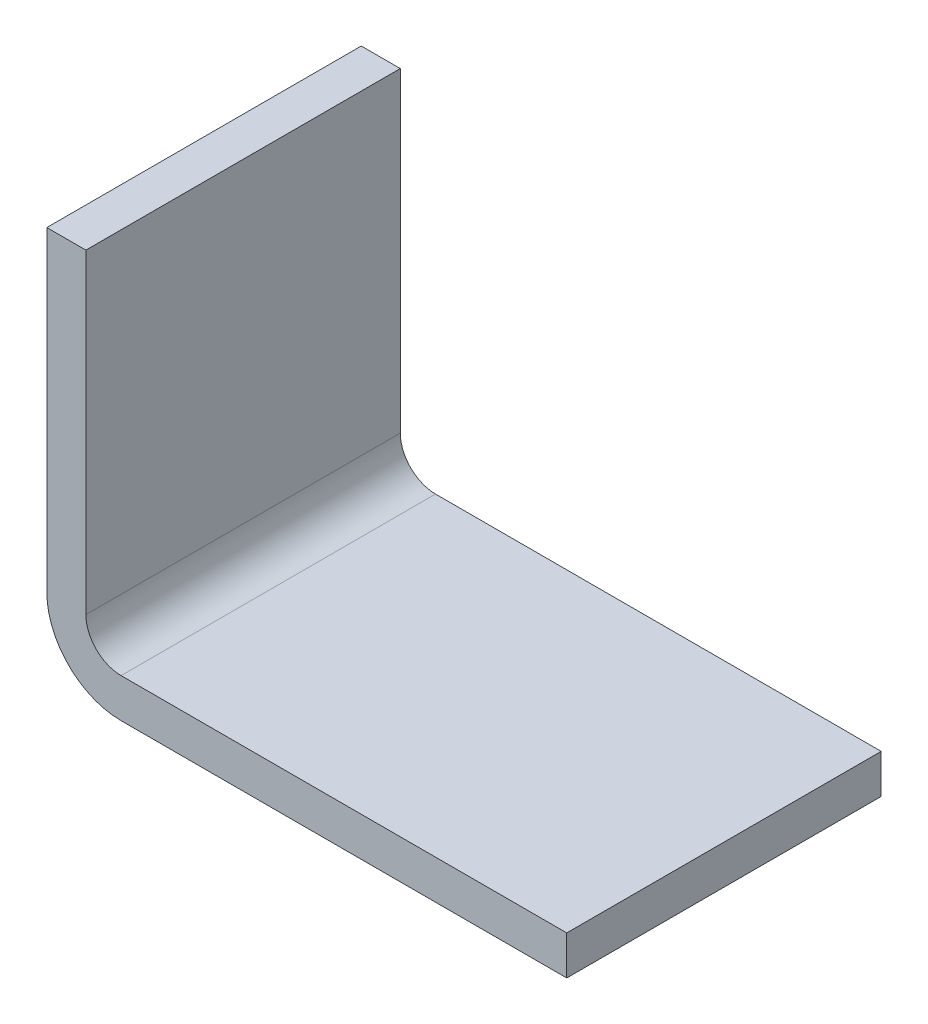
ISO-10303-21;
HEADER;
FILE_DESCRIPTION(('STEP AP214'),'2;1');
FILE_NAME('part.step','',(''),(''),'','','');
FILE_SCHEMA(('AUTOMOTIVE_DESIGN { 1 0 10303 214 1 1 1 1 }'));
ENDSEC;
DATA;
#1=APPLICATION_CONTEXT('core data for automotive mechanical design processes');
#2=APPLICATION_PROTOCOL_DEFINITION('international standard','automotive_design',2000,#1);
#3=PRODUCT_CONTEXT('',#1,'mechanical');
#4=PRODUCT('Part','Part','',(#3));
#5=PRODUCT_RELATED_PRODUCT_CATEGORY('part','',(#4));
#6=PRODUCT_DEFINITION_FORMATION('','',#4);
#7=PRODUCT_DEFINITION_CONTEXT('part definition',#1,'design');
#8=PRODUCT_DEFINITION('design','',#6,#7);
#9=PRODUCT_DEFINITION_SHAPE('','',#8);
#10=(LENGTH_UNIT() NAMED_UNIT(*) SI_UNIT(.MILLI.,.METRE.));
#11=(NAMED_UNIT(*) PLANE_ANGLE_UNIT() SI_UNIT($,.RADIAN.));
#12=(NAMED_UNIT(*) SI_UNIT($,.STERADIAN.) SOLID_ANGLE_UNIT());
#13=UNCERTAINTY_MEASURE_WITH_UNIT(LENGTH_MEASURE(1.E-05),#10,'distance_accuracy_value','');
#14=(GEOMETRIC_REPRESENTATION_CONTEXT(3) GLOBAL_UNCERTAINTY_ASSIGNED_CONTEXT((#13)) GLOBAL_UNIT_ASSIGNED_CONTEXT((#10,
#11,#12)) REPRESENTATION_CONTEXT('',''));
#15=CARTESIAN_POINT('',(0.,0.,0.));
#16=DIRECTION('',(0.,0.,1.));
#17=DIRECTION('',(1.,0.,0.));
#18=AXIS2_PLACEMENT_3D('',#15,#16,#17);
#19=CARTESIAN_POINT('',(0.,6.31,50.8));
#20=DIRECTION('',(-1.,0.,0.));
#21=DIRECTION('',(0.,0.,1.));
#22=AXIS2_PLACEMENT_3D('',#19,#20,#21);
#23=PLANE('',#22);
#24=DIRECTION('',(0.,1.,0.));
#25=VECTOR('',#24,1.);
#26=CARTESIAN_POINT('',(0.,6.31,0.));
#27=LINE('',#26,#25);
#28=CARTESIAN_POINT('',(0.,0.,0.));
#29=VERTEX_POINT('',#28);
#30=CARTESIAN_POINT('',(0.,6.31,0.));
#31=VERTEX_POINT('',#30);
#32=EDGE_CURVE('E129',#29,#31,#27,.T.);
#33=ORIENTED_EDGE('',*,*,#32,.T.);
#34=DIRECTION('',(0.,0.,-1.));
#35=VECTOR('',#34,1.);
#36=CARTESIAN_POINT('',(0.,6.31,50.8));
#37=LINE('',#36,#35);
#38=CARTESIAN_POINT('',(0.,6.31,50.8));
#39=VERTEX_POINT('',#38);
#40=EDGE_CURVE('E11',#39,#31,#37,.T.);
#41=ORIENTED_EDGE('',*,*,#40,.F.);
#42=DIRECTION('',(0.,1.,0.));
#43=VECTOR('',#42,1.);
#44=CARTESIAN_POINT('',(0.,6.31,50.8));
#45=LINE('',#44,#43);
#46=CARTESIAN_POINT('',(0.,0.,50.8));
#47=VERTEX_POINT('',#46);
#48=EDGE_CURVE('E143',#47,#39,#45,.T.);
#49=ORIENTED_EDGE('',*,*,#48,.F.);
#50=DIRECTION('',(0.,0.,-1.));
#51=VECTOR('',#50,1.);
#52=CARTESIAN_POINT('',(0.,0.,50.8));
#53=LINE('',#52,#51);
#54=EDGE_CURVE('E125',#47,#29,#53,.T.);
#55=ORIENTED_EDGE('',*,*,#54,.T.);
#56=EDGE_LOOP('',(#33,#41,#49,#55));
#57=FACE_BOUND('',#56,.T.);
#58=ADVANCED_FACE('F33',(#57),#23,.F.);
#59=CARTESIAN_POINT('',(0.,6.31,50.8));
#60=DIRECTION('',(0.,-1.,0.));
#61=DIRECTION('',(0.,0.,-1.));
#62=AXIS2_PLACEMENT_3D('',#59,#60,#61);
#63=PLANE('',#62);
#64=DIRECTION('',(-1.,0.,0.));
#65=VECTOR('',#64,1.);
#66=CARTESIAN_POINT('',(0.,6.31,0.));
#67=LINE('',#66,#65);
#68=CARTESIAN_POINT('',(-71.9999999999999,6.31,0.));
#69=VERTEX_POINT('',#68);
#70=EDGE_CURVE('E132',#31,#69,#67,.T.);
#71=ORIENTED_EDGE('',*,*,#70,.T.);
#72=DIRECTION('',(0.,0.,-1.));
#73=VECTOR('',#72,1.);
#74=CARTESIAN_POINT('',(-71.9999999999999,6.31,50.8));
#75=LINE('',#74,#73);
#76=CARTESIAN_POINT('',(-71.9999999999999,6.31,50.8));
#77=VERTEX_POINT('',#76);
#78=EDGE_CURVE('E41',#77,#69,#75,.T.);
#79=ORIENTED_EDGE('',*,*,#78,.F.);
#80=DIRECTION('',(-1.,0.,0.));
#81=VECTOR('',#80,1.);
#82=CARTESIAN_POINT('',(0.,6.31,50.8));
#83=LINE('',#82,#81);
#84=EDGE_CURVE('E92',#39,#77,#83,.T.);
#85=ORIENTED_EDGE('',*,*,#84,.F.);
#86=ORIENTED_EDGE('',*,*,#40,.T.);
#87=EDGE_LOOP('',(#71,#79,#85,#86));
#88=FACE_BOUND('',#87,.T.);
#89=ADVANCED_FACE('F178',(#88),#63,.F.);
#90=CARTESIAN_POINT('',(-72.,12.,50.8));
#91=DIRECTION('',(0.,0.,-1.));
#92=DIRECTION('',(-1.,0.,0.));
#93=AXIS2_PLACEMENT_3D('',#90,#91,#92);
#94=CYLINDRICAL_SURFACE('',#93,5.69);
#95=CARTESIAN_POINT('',(-72.,12.,0.));
#96=DIRECTION('',(0.,0.,-1.));
#97=DIRECTION('',(-1.,0.,0.));
#98=AXIS2_PLACEMENT_3D('',#95,#96,#97);
#99=CIRCLE('',#98,5.69);
#100=CARTESIAN_POINT('',(-77.69,12.,0.));
#101=VERTEX_POINT('',#100);
#102=EDGE_CURVE('E134',#69,#101,#99,.T.);
#103=ORIENTED_EDGE('',*,*,#102,.T.);
#104=DIRECTION('',(0.,0.,-1.));
#105=VECTOR('',#104,1.);
#106=CARTESIAN_POINT('',(-77.69,12.,50.8));
#107=LINE('',#106,#105);
#108=CARTESIAN_POINT('',(-77.69,12.,50.8));
#109=VERTEX_POINT('',#108);
#110=EDGE_CURVE('E150',#109,#101,#107,.T.);
#111=ORIENTED_EDGE('',*,*,#110,.F.);
#112=CARTESIAN_POINT('',(-72.,12.,50.8));
#113=DIRECTION('',(0.,0.,-1.));
#114=DIRECTION('',(-1.,0.,0.));
#115=AXIS2_PLACEMENT_3D('',#112,#113,#114);
#116=CIRCLE('',#115,5.69);
#117=EDGE_CURVE('E158',#77,#109,#116,.T.);
#118=ORIENTED_EDGE('',*,*,#117,.F.);
#119=ORIENTED_EDGE('',*,*,#78,.T.);
#120=EDGE_LOOP('',(#103,#111,#118,#119));
#121=FACE_BOUND('',#120,.T.);
#122=ADVANCED_FACE('F156',(#121),#94,.F.);
#123=CARTESIAN_POINT('',(-77.69,12.,50.8));
#124=DIRECTION('',(-1.,0.,0.));
#125=DIRECTION('',(0.,0.,1.));
#126=AXIS2_PLACEMENT_3D('',#123,#124,#125);
#127=PLANE('',#126);
#128=DIRECTION('',(0.,1.,0.));
#129=VECTOR('',#128,1.);
#130=CARTESIAN_POINT('',(-77.69,12.,0.));
#131=LINE('',#130,#129);
#132=CARTESIAN_POINT('',(-77.69,63.,0.));
#133=VERTEX_POINT('',#132);
#134=EDGE_CURVE('E136',#101,#133,#131,.T.);
#135=ORIENTED_EDGE('',*,*,#134,.T.);
#136=DIRECTION('',(0.,0.,-1.));
#137=VECTOR('',#136,1.);
#138=CARTESIAN_POINT('',(-77.69,63.,50.8));
#139=LINE('',#138,#137);
#140=CARTESIAN_POINT('',(-77.69,63.,50.8));
#141=VERTEX_POINT('',#140);
#142=EDGE_CURVE('E147',#141,#133,#139,.T.);
#143=ORIENTED_EDGE('',*,*,#142,.F.);
#144=DIRECTION('',(0.,1.,0.));
#145=VECTOR('',#144,1.);
#146=CARTESIAN_POINT('',(-77.69,12.,50.8));
#147=LINE('',#146,#145);
#148=EDGE_CURVE('E170',#109,#141,#147,.T.);
#149=ORIENTED_EDGE('',*,*,#148,.F.);
#150=ORIENTED_EDGE('',*,*,#110,.T.);
#151=EDGE_LOOP('',(#135,#143,#149,#150));
#152=FACE_BOUND('',#151,.T.);
#153=ADVANCED_FACE('F166',(#152),#127,.F.);
#154=CARTESIAN_POINT('',(-77.69,63.,50.8));
#155=DIRECTION('',(0.,-1.,0.));
#156=DIRECTION('',(0.,0.,-1.));
#157=AXIS2_PLACEMENT_3D('',#154,#155,#156);
#158=PLANE('',#157);
#159=DIRECTION('',(-1.,0.,0.));
#160=VECTOR('',#159,1.);
#161=CARTESIAN_POINT('',(-77.69,63.,0.));
#162=LINE('',#161,#160);
#163=CARTESIAN_POINT('',(-84.,63.,0.));
#164=VERTEX_POINT('',#163);
#165=EDGE_CURVE('E138',#133,#164,#162,.T.);
#166=ORIENTED_EDGE('',*,*,#165,.T.);
#167=DIRECTION('',(0.,0.,-1.));
#168=VECTOR('',#167,1.);
#169=CARTESIAN_POINT('',(-84.,63.,50.8));
#170=LINE('',#169,#168);
#171=CARTESIAN_POINT('',(-84.,63.,50.8));
#172=VERTEX_POINT('',#171);
#173=EDGE_CURVE('E120',#172,#164,#170,.T.);
#174=ORIENTED_EDGE('',*,*,#173,.F.);
#175=DIRECTION('',(-1.,0.,0.));
#176=VECTOR('',#175,1.);
#177=CARTESIAN_POINT('',(-77.69,63.,50.8));
#178=LINE('',#177,#176);
#179=EDGE_CURVE('E111',#141,#172,#178,.T.);
#180=ORIENTED_EDGE('',*,*,#179,.F.);
#181=ORIENTED_EDGE('',*,*,#142,.T.);
#182=EDGE_LOOP('',(#166,#174,#180,#181));
#183=FACE_BOUND('',#182,.T.);
#184=ADVANCED_FACE('F169',(#183),#158,.F.);
#185=CARTESIAN_POINT('',(-84.,12.0000000000001,50.8));
#186=DIRECTION('',(1.,0.,0.));
#187=DIRECTION('',(0.,0.,-1.));
#188=AXIS2_PLACEMENT_3D('',#185,#186,#187);
#189=PLANE('',#188);
#190=DIRECTION('',(0.,-1.,0.));
#191=VECTOR('',#190,1.);
#192=CARTESIAN_POINT('',(-84.,12.0000000000001,0.));
#193=LINE('',#192,#191);
#194=CARTESIAN_POINT('',(-84.,12.,0.));
#195=VERTEX_POINT('',#194);
#196=EDGE_CURVE('E119',#164,#195,#193,.T.);
#197=ORIENTED_EDGE('',*,*,#196,.T.);
#198=DIRECTION('',(0.,0.,-1.));
#199=VECTOR('',#198,1.);
#200=CARTESIAN_POINT('',(-84.,12.,50.8));
#201=LINE('',#200,#199);
#202=CARTESIAN_POINT('',(-84.,12.,50.8));
#203=VERTEX_POINT('',#202);
#204=EDGE_CURVE('E116',#203,#195,#201,.T.);
#205=ORIENTED_EDGE('',*,*,#204,.F.);
#206=DIRECTION('',(0.,-1.,0.));
#207=VECTOR('',#206,1.);
#208=CARTESIAN_POINT('',(-84.,12.0000000000001,50.8));
#209=LINE('',#208,#207);
#210=EDGE_CURVE('E105',#172,#203,#209,.T.);
#211=ORIENTED_EDGE('',*,*,#210,.F.);
#212=ORIENTED_EDGE('',*,*,#173,.T.);
#213=EDGE_LOOP('',(#197,#205,#211,#212));
#214=FACE_BOUND('',#213,.T.);
#215=ADVANCED_FACE('F117',(#214),#189,.F.);
#216=CARTESIAN_POINT('',(-72.,12.,50.8));
#217=DIRECTION('',(0.,0.,-1.));
#218=DIRECTION('',(-1.,0.,0.));
#219=AXIS2_PLACEMENT_3D('',#216,#217,#218);
#220=CYLINDRICAL_SURFACE('',#219,12.);
#221=CARTESIAN_POINT('',(-72.,12.,0.));
#222=DIRECTION('',(0.,0.,1.));
#223=DIRECTION('',(-1.,0.,0.));
#224=AXIS2_PLACEMENT_3D('',#221,#222,#223);
#225=CIRCLE('',#224,12.);
#226=CARTESIAN_POINT('',(-71.9999999999999,0.,0.));
#227=VERTEX_POINT('',#226);
#228=EDGE_CURVE('E78',#195,#227,#225,.T.);
#229=ORIENTED_EDGE('',*,*,#228,.T.);
#230=DIRECTION('',(0.,0.,-1.));
#231=VECTOR('',#230,1.);
#232=CARTESIAN_POINT('',(-71.9999999999999,0.,50.8));
#233=LINE('',#232,#231);
#234=CARTESIAN_POINT('',(-71.9999999999999,0.,50.8));
#235=VERTEX_POINT('',#234);
#236=EDGE_CURVE('E121',#235,#227,#233,.T.);
#237=ORIENTED_EDGE('',*,*,#236,.F.);
#238=CARTESIAN_POINT('',(-72.,12.,50.8));
#239=DIRECTION('',(0.,0.,1.));
#240=DIRECTION('',(-1.,0.,0.));
#241=AXIS2_PLACEMENT_3D('',#238,#239,#240);
#242=CIRCLE('',#241,12.);
#243=EDGE_CURVE('E109',#203,#235,#242,.T.);
#244=ORIENTED_EDGE('',*,*,#243,.F.);
#245=ORIENTED_EDGE('',*,*,#204,.T.);
#246=EDGE_LOOP('',(#229,#237,#244,#245));
#247=FACE_BOUND('',#246,.T.);
#248=ADVANCED_FACE('F123',(#247),#220,.T.);
#249=CARTESIAN_POINT('',(0.,0.,50.8));
#250=DIRECTION('',(0.,1.,0.));
#251=DIRECTION('',(0.,0.,1.));
#252=AXIS2_PLACEMENT_3D('',#249,#250,#251);
#253=PLANE('',#252);
#254=DIRECTION('',(1.,0.,0.));
#255=VECTOR('',#254,1.);
#256=CARTESIAN_POINT('',(0.,0.,0.));
#257=LINE('',#256,#255);
#258=EDGE_CURVE('E84',#227,#29,#257,.T.);
#259=ORIENTED_EDGE('',*,*,#258,.T.);
#260=ORIENTED_EDGE('',*,*,#54,.F.);
#261=DIRECTION('',(1.,0.,0.));
#262=VECTOR('',#261,1.);
#263=CARTESIAN_POINT('',(0.,0.,50.8));
#264=LINE('',#263,#262);
#265=EDGE_CURVE('E49',#235,#47,#264,.T.);
#266=ORIENTED_EDGE('',*,*,#265,.F.);
#267=ORIENTED_EDGE('',*,*,#236,.T.);
#268=EDGE_LOOP('',(#259,#260,#266,#267));
#269=FACE_BOUND('',#268,.T.);
#270=ADVANCED_FACE('F194',(#269),#253,.F.);
#271=CARTESIAN_POINT('',(-72.,12.,50.8));
#272=DIRECTION('',(0.,0.,-1.));
#273=DIRECTION('',(-1.,0.,0.));
#274=AXIS2_PLACEMENT_3D('',#271,#272,#273);
#275=PLANE('',#274);
#276=ORIENTED_EDGE('',*,*,#48,.T.);
#277=ORIENTED_EDGE('',*,*,#84,.T.);
#278=ORIENTED_EDGE('',*,*,#117,.T.);
#279=ORIENTED_EDGE('',*,*,#148,.T.);
#280=ORIENTED_EDGE('',*,*,#179,.T.);
#281=ORIENTED_EDGE('',*,*,#210,.T.);
#282=ORIENTED_EDGE('',*,*,#243,.T.);
#283=ORIENTED_EDGE('',*,*,#265,.T.);
#284=EDGE_LOOP('',(#276,#277,#278,#279,#280,#281,#282,#283));
#285=FACE_BOUND('',#284,.T.);
#286=ADVANCED_FACE('F107',(#285),#275,.F.);
#287=CARTESIAN_POINT('',(-72.,12.,0.));
#288=DIRECTION('',(0.,0.,-1.));
#289=DIRECTION('',(-1.,0.,0.));
#290=AXIS2_PLACEMENT_3D('',#287,#288,#289);
#291=PLANE('',#290);
#292=ORIENTED_EDGE('',*,*,#32,.F.);
#293=ORIENTED_EDGE('',*,*,#258,.F.);
#294=ORIENTED_EDGE('',*,*,#228,.F.);
#295=ORIENTED_EDGE('',*,*,#196,.F.);
#296=ORIENTED_EDGE('',*,*,#165,.F.);
#297=ORIENTED_EDGE('',*,*,#134,.F.);
#298=ORIENTED_EDGE('',*,*,#102,.F.);
#299=ORIENTED_EDGE('',*,*,#70,.F.);
#300=EDGE_LOOP('',(#292,#293,#294,#295,#296,#297,#298,#299));
#301=FACE_BOUND('',#300,.T.);
#302=ADVANCED_FACE('F162',(#301),#291,.T.);
#303=CLOSED_SHELL('',(#58,#89,#122,#153,#184,#215,#248,#270,#286,#302));
#304=MANIFOLD_SOLID_BREP('B2',#303);
#305=ADVANCED_BREP_SHAPE_REPRESENTATION('',(#18,#304),#14);
#306=SHAPE_DEFINITION_REPRESENTATION(#9,#305);
ENDSEC;
END-ISO-10303-21;
